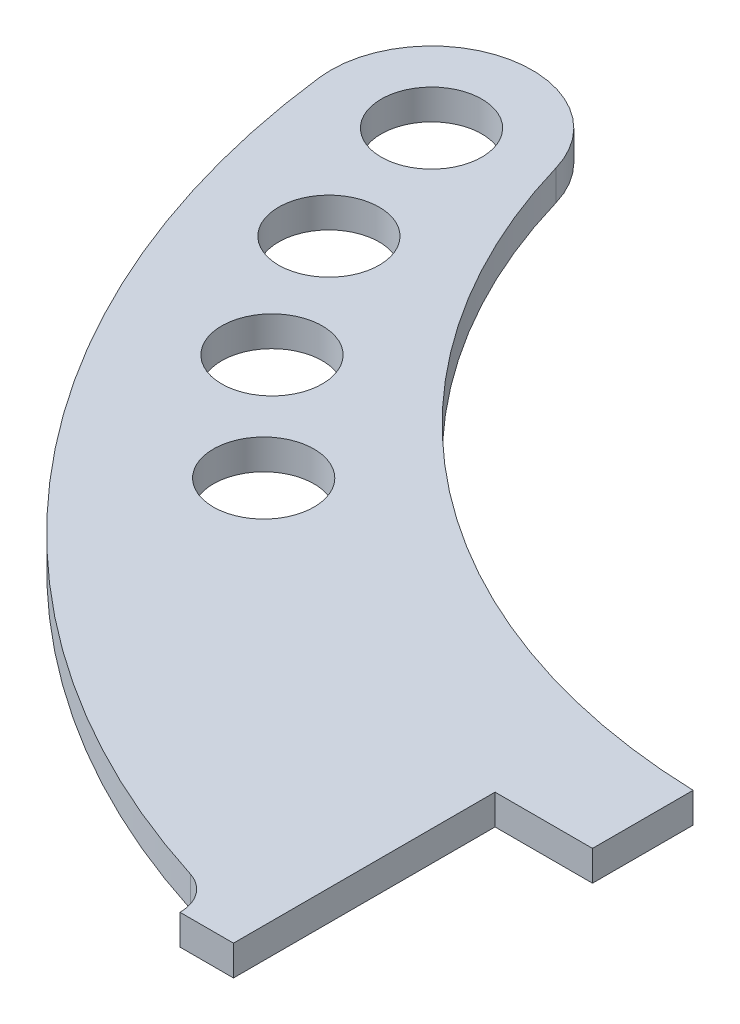
ISO-10303-21;
HEADER;
FILE_DESCRIPTION(('STEP AP214'),'2;1');
FILE_NAME('part.step','',(''),(''),'','','');
FILE_SCHEMA(('AUTOMOTIVE_DESIGN { 1 0 10303 214 1 1 1 1 }'));
ENDSEC;
DATA;
#1=APPLICATION_CONTEXT('core data for automotive mechanical design processes');
#2=APPLICATION_PROTOCOL_DEFINITION('international standard','automotive_design',2000,#1);
#3=PRODUCT_CONTEXT('',#1,'mechanical');
#4=PRODUCT('Part','Part','',(#3));
#5=PRODUCT_RELATED_PRODUCT_CATEGORY('part','',(#4));
#6=PRODUCT_DEFINITION_FORMATION('','',#4);
#7=PRODUCT_DEFINITION_CONTEXT('part definition',#1,'design');
#8=PRODUCT_DEFINITION('design','',#6,#7);
#9=PRODUCT_DEFINITION_SHAPE('','',#8);
#10=(LENGTH_UNIT() NAMED_UNIT(*) SI_UNIT(.MILLI.,.METRE.));
#11=(NAMED_UNIT(*) PLANE_ANGLE_UNIT() SI_UNIT($,.RADIAN.));
#12=(NAMED_UNIT(*) SI_UNIT($,.STERADIAN.) SOLID_ANGLE_UNIT());
#13=UNCERTAINTY_MEASURE_WITH_UNIT(LENGTH_MEASURE(1.E-05),#10,'distance_accuracy_value','');
#14=(GEOMETRIC_REPRESENTATION_CONTEXT(3) GLOBAL_UNCERTAINTY_ASSIGNED_CONTEXT((#13)) GLOBAL_UNIT_ASSIGNED_CONTEXT((#10,
#11,#12)) REPRESENTATION_CONTEXT('',''));
#15=CARTESIAN_POINT('',(0.,0.,0.));
#16=DIRECTION('',(0.,0.,1.));
#17=DIRECTION('',(1.,0.,0.));
#18=AXIS2_PLACEMENT_3D('',#15,#16,#17);
#19=CARTESIAN_POINT('',(145.,-207.873034199098,540.));
#20=DIRECTION('',(0.,-1.,0.));
#21=DIRECTION('',(0.,0.,-1.));
#22=AXIS2_PLACEMENT_3D('',#19,#20,#21);
#23=PLANE('',#22);
#24=CARTESIAN_POINT('',(96.7810636189554,-207.873034199098,588.462057724622));
#25=DIRECTION('',(0.,1.,0.));
#26=DIRECTION('',(0.,0.,1.));
#27=AXIS2_PLACEMENT_3D('',#24,#25,#26);
#28=CIRCLE('',#27,5.00000000000001);
#29=CARTESIAN_POINT('',(96.7810636189554,-207.873034199098,593.462057724622));
#30=VERTEX_POINT('',#29);
#31=EDGE_CURVE('E119',#30,#30,#28,.T.);
#32=ORIENTED_EDGE('',*,*,#31,.F.);
#33=EDGE_LOOP('',(#32));
#34=FACE_BOUND('',#33,.T.);
#35=CARTESIAN_POINT('',(86.5943439074399,-207.873034199098,577.45157446915));
#36=DIRECTION('',(0.,1.,0.));
#37=DIRECTION('',(0.,0.,1.));
#38=AXIS2_PLACEMENT_3D('',#35,#36,#37);
#39=CIRCLE('',#38,5.00000000000001);
#40=CARTESIAN_POINT('',(86.5943439074399,-207.873034199098,582.45157446915));
#41=VERTEX_POINT('',#40);
#42=EDGE_CURVE('E185',#41,#41,#39,.T.);
#43=ORIENTED_EDGE('',*,*,#42,.F.);
#44=EDGE_LOOP('',(#43));
#45=FACE_BOUND('',#44,.T.);
#46=CARTESIAN_POINT('',(79.2027781411678,-207.873034199098,564.399189418024));
#47=DIRECTION('',(0.,1.,0.));
#48=DIRECTION('',(0.,0.,1.));
#49=AXIS2_PLACEMENT_3D('',#46,#47,#48);
#50=CIRCLE('',#49,5.00000000000001);
#51=CARTESIAN_POINT('',(79.2027781411678,-207.873034199098,569.399189418024));
#52=VERTEX_POINT('',#51);
#53=EDGE_CURVE('E189',#52,#52,#50,.T.);
#54=ORIENTED_EDGE('',*,*,#53,.F.);
#55=EDGE_LOOP('',(#54));
#56=FACE_BOUND('',#55,.T.);
#57=CARTESIAN_POINT('',(75.,-207.873034199098,550.));
#58=DIRECTION('',(0.,1.,0.));
#59=DIRECTION('',(0.,0.,1.));
#60=AXIS2_PLACEMENT_3D('',#57,#58,#59);
#61=CIRCLE('',#60,5.00000000000001);
#62=CARTESIAN_POINT('',(75.,-207.873034199098,555.));
#63=VERTEX_POINT('',#62);
#64=EDGE_CURVE('E192',#63,#63,#61,.T.);
#65=ORIENTED_EDGE('',*,*,#64,.F.);
#66=EDGE_LOOP('',(#65));
#67=FACE_BOUND('',#66,.T.);
#68=CARTESIAN_POINT('',(147.009050664026,-207.873034199098,529.031055761777));
#69=DIRECTION('',(0.,1.,0.));
#70=DIRECTION('',(0.,0.,1.));
#71=AXIS2_PLACEMENT_3D('',#68,#69,#70);
#72=CIRCLE('',#71,65.);
#73=CARTESIAN_POINT('',(84.6012067552035,-207.873034199098,547.204140768237));
#74=VERTEX_POINT('',#73);
#75=CARTESIAN_POINT('',(145.,-207.873034199098,594.));
#76=VERTEX_POINT('',#75);
#77=EDGE_CURVE('E61',#74,#76,#72,.T.);
#78=ORIENTED_EDGE('',*,*,#77,.F.);
#79=CARTESIAN_POINT('',(75.,-207.873034199098,550.));
#80=DIRECTION('',(0.,1.,0.));
#81=DIRECTION('',(0.,0.,1.));
#82=AXIS2_PLACEMENT_3D('',#79,#80,#81);
#83=CIRCLE('',#82,10.);
#84=CARTESIAN_POINT('',(65.0722641480603,-207.873034199098,551.200025355612));
#85=VERTEX_POINT('',#84);
#86=EDGE_CURVE('E214',#74,#85,#83,.T.);
#87=ORIENTED_EDGE('',*,*,#86,.T.);
#88=CARTESIAN_POINT('',(154.421886815518,-207.873034199098,540.399797155107));
#89=DIRECTION('',(0.,1.,0.));
#90=DIRECTION('',(0.,0.,1.));
#91=AXIS2_PLACEMENT_3D('',#88,#89,#90);
#92=CIRCLE('',#91,90.);
#93=CARTESIAN_POINT('',(127.20944199215,-207.873034199098,626.187225410856));
#94=VERTEX_POINT('',#93);
#95=EDGE_CURVE('E211',#85,#94,#92,.T.);
#96=ORIENTED_EDGE('',*,*,#95,.T.);
#97=CARTESIAN_POINT('',(126.,-207.873034199098,630.));
#98=DIRECTION('',(0.,1.,0.));
#99=DIRECTION('',(0.,0.,1.));
#100=AXIS2_PLACEMENT_3D('',#97,#98,#99);
#101=CIRCLE('',#100,4.00000000000003);
#102=CARTESIAN_POINT('',(130.,-207.873034199098,630.));
#103=VERTEX_POINT('',#102);
#104=EDGE_CURVE('E208',#94,#103,#101,.F.);
#105=ORIENTED_EDGE('',*,*,#104,.T.);
#106=DIRECTION('',(-1.,0.,0.));
#107=VECTOR('',#106,1.);
#108=CARTESIAN_POINT('',(145.,-207.873034199098,630.));
#109=LINE('',#108,#107);
#110=CARTESIAN_POINT('',(135.315012025401,-207.873034199098,630.));
#111=VERTEX_POINT('',#110);
#112=EDGE_CURVE('E134',#111,#103,#109,.T.);
#113=ORIENTED_EDGE('',*,*,#112,.F.);
#114=DIRECTION('',(0.,0.,-1.));
#115=VECTOR('',#114,1.);
#116=CARTESIAN_POINT('',(135.315012025401,-207.873034199098,0.));
#117=LINE('',#116,#115);
#118=CARTESIAN_POINT('',(135.315012025401,-207.873034199098,604.));
#119=VERTEX_POINT('',#118);
#120=EDGE_CURVE('E118',#111,#119,#117,.T.);
#121=ORIENTED_EDGE('',*,*,#120,.T.);
#122=DIRECTION('',(1.,0.,0.));
#123=VECTOR('',#122,1.);
#124=CARTESIAN_POINT('',(0.,-207.873034199098,604.));
#125=LINE('',#124,#123);
#126=CARTESIAN_POINT('',(145.,-207.873034199098,604.));
#127=VERTEX_POINT('',#126);
#128=EDGE_CURVE('E105',#119,#127,#125,.T.);
#129=ORIENTED_EDGE('',*,*,#128,.T.);
#130=DIRECTION('',(0.,0.,1.));
#131=VECTOR('',#130,1.);
#132=CARTESIAN_POINT('',(145.,-207.873034199098,540.));
#133=LINE('',#132,#131);
#134=EDGE_CURVE('E116',#76,#127,#133,.T.);
#135=ORIENTED_EDGE('',*,*,#134,.F.);
#136=EDGE_LOOP('',(#78,#87,#96,#105,#113,#121,#129,#135));
#137=FACE_BOUND('',#136,.T.);
#138=ADVANCED_FACE('F39',(#34,#45,#56,#67,#137),#23,.F.);
#139=CARTESIAN_POINT('',(145.,-210.873034199098,540.));
#140=DIRECTION('',(0.,1.,0.));
#141=DIRECTION('',(0.,0.,1.));
#142=AXIS2_PLACEMENT_3D('',#139,#140,#141);
#143=PLANE('',#142);
#144=CARTESIAN_POINT('',(96.7810636189554,-210.873034199098,588.462057724622));
#145=DIRECTION('',(0.,1.,0.));
#146=DIRECTION('',(0.,0.,1.));
#147=AXIS2_PLACEMENT_3D('',#144,#145,#146);
#148=CIRCLE('',#147,5.00000000000001);
#149=CARTESIAN_POINT('',(96.7810636189554,-210.873034199098,593.462057724622));
#150=VERTEX_POINT('',#149);
#151=EDGE_CURVE('E123',#150,#150,#148,.T.);
#152=ORIENTED_EDGE('',*,*,#151,.T.);
#153=EDGE_LOOP('',(#152));
#154=FACE_BOUND('',#153,.T.);
#155=CARTESIAN_POINT('',(86.5943439074399,-210.873034199098,577.45157446915));
#156=DIRECTION('',(0.,1.,0.));
#157=DIRECTION('',(0.,0.,1.));
#158=AXIS2_PLACEMENT_3D('',#155,#156,#157);
#159=CIRCLE('',#158,5.00000000000001);
#160=CARTESIAN_POINT('',(86.5943439074399,-210.873034199098,582.45157446915));
#161=VERTEX_POINT('',#160);
#162=EDGE_CURVE('E128',#161,#161,#159,.T.);
#163=ORIENTED_EDGE('',*,*,#162,.T.);
#164=EDGE_LOOP('',(#163));
#165=FACE_BOUND('',#164,.T.);
#166=CARTESIAN_POINT('',(79.2027781411678,-210.873034199098,564.399189418024));
#167=DIRECTION('',(0.,1.,0.));
#168=DIRECTION('',(0.,0.,1.));
#169=AXIS2_PLACEMENT_3D('',#166,#167,#168);
#170=CIRCLE('',#169,5.00000000000001);
#171=CARTESIAN_POINT('',(79.2027781411678,-210.873034199098,569.399189418024));
#172=VERTEX_POINT('',#171);
#173=EDGE_CURVE('E145',#172,#172,#170,.T.);
#174=ORIENTED_EDGE('',*,*,#173,.T.);
#175=EDGE_LOOP('',(#174));
#176=FACE_BOUND('',#175,.T.);
#177=CARTESIAN_POINT('',(75.,-210.873034199098,550.));
#178=DIRECTION('',(0.,1.,0.));
#179=DIRECTION('',(0.,0.,1.));
#180=AXIS2_PLACEMENT_3D('',#177,#178,#179);
#181=CIRCLE('',#180,5.00000000000001);
#182=CARTESIAN_POINT('',(75.,-210.873034199098,555.));
#183=VERTEX_POINT('',#182);
#184=EDGE_CURVE('E142',#183,#183,#181,.T.);
#185=ORIENTED_EDGE('',*,*,#184,.T.);
#186=EDGE_LOOP('',(#185));
#187=FACE_BOUND('',#186,.T.);
#188=CARTESIAN_POINT('',(154.421886815518,-210.873034199098,540.399797155107));
#189=DIRECTION('',(0.,1.,0.));
#190=DIRECTION('',(0.,0.,1.));
#191=AXIS2_PLACEMENT_3D('',#188,#189,#190);
#192=CIRCLE('',#191,90.);
#193=CARTESIAN_POINT('',(65.0722641480603,-210.873034199098,551.200025355612));
#194=VERTEX_POINT('',#193);
#195=CARTESIAN_POINT('',(127.20944199215,-210.873034199098,626.187225410856));
#196=VERTEX_POINT('',#195);
#197=EDGE_CURVE('E139',#194,#196,#192,.T.);
#198=ORIENTED_EDGE('',*,*,#197,.F.);
#199=CARTESIAN_POINT('',(75.,-210.873034199098,550.));
#200=DIRECTION('',(0.,1.,0.));
#201=DIRECTION('',(0.,0.,1.));
#202=AXIS2_PLACEMENT_3D('',#199,#200,#201);
#203=CIRCLE('',#202,10.);
#204=CARTESIAN_POINT('',(84.6012067552035,-210.873034199098,547.204140768237));
#205=VERTEX_POINT('',#204);
#206=EDGE_CURVE('E111',#205,#194,#203,.T.);
#207=ORIENTED_EDGE('',*,*,#206,.F.);
#208=CARTESIAN_POINT('',(147.009050664026,-210.873034199098,529.031055761777));
#209=DIRECTION('',(0.,1.,0.));
#210=DIRECTION('',(0.,0.,1.));
#211=AXIS2_PLACEMENT_3D('',#208,#209,#210);
#212=CIRCLE('',#211,65.);
#213=CARTESIAN_POINT('',(145.,-210.873034199098,594.));
#214=VERTEX_POINT('',#213);
#215=EDGE_CURVE('E220',#205,#214,#212,.T.);
#216=ORIENTED_EDGE('',*,*,#215,.T.);
#217=DIRECTION('',(0.,0.,-1.));
#218=VECTOR('',#217,1.);
#219=CARTESIAN_POINT('',(145.,-210.873034199098,540.));
#220=LINE('',#219,#218);
#221=CARTESIAN_POINT('',(145.,-210.873034199098,604.));
#222=VERTEX_POINT('',#221);
#223=EDGE_CURVE('E122',#222,#214,#220,.T.);
#224=ORIENTED_EDGE('',*,*,#223,.F.);
#225=DIRECTION('',(1.,0.,0.));
#226=VECTOR('',#225,1.);
#227=CARTESIAN_POINT('',(145.,-210.873034199098,604.));
#228=LINE('',#227,#226);
#229=CARTESIAN_POINT('',(135.315012025401,-210.873034199098,604.));
#230=VERTEX_POINT('',#229);
#231=EDGE_CURVE('E53',#230,#222,#228,.T.);
#232=ORIENTED_EDGE('',*,*,#231,.F.);
#233=DIRECTION('',(0.,0.,-1.));
#234=VECTOR('',#233,1.);
#235=CARTESIAN_POINT('',(135.315012025401,-210.873034199098,540.));
#236=LINE('',#235,#234);
#237=CARTESIAN_POINT('',(135.315012025401,-210.873034199098,630.));
#238=VERTEX_POINT('',#237);
#239=EDGE_CURVE('E11',#238,#230,#236,.T.);
#240=ORIENTED_EDGE('',*,*,#239,.F.);
#241=DIRECTION('',(-1.,0.,0.));
#242=VECTOR('',#241,1.);
#243=CARTESIAN_POINT('',(145.,-210.873034199098,630.));
#244=LINE('',#243,#242);
#245=CARTESIAN_POINT('',(130.,-210.873034199098,630.));
#246=VERTEX_POINT('',#245);
#247=EDGE_CURVE('E125',#238,#246,#244,.T.);
#248=ORIENTED_EDGE('',*,*,#247,.T.);
#249=CARTESIAN_POINT('',(126.,-210.873034199098,630.));
#250=DIRECTION('',(0.,1.,0.));
#251=DIRECTION('',(0.,0.,1.));
#252=AXIS2_PLACEMENT_3D('',#249,#250,#251);
#253=CIRCLE('',#252,4.00000000000003);
#254=EDGE_CURVE('E46',#196,#246,#253,.F.);
#255=ORIENTED_EDGE('',*,*,#254,.F.);
#256=EDGE_LOOP('',(#198,#207,#216,#224,#232,#240,#248,#255));
#257=FACE_BOUND('',#256,.T.);
#258=ADVANCED_FACE('F151',(#154,#165,#176,#187,#257),#143,.F.);
#259=CARTESIAN_POINT('',(145.,-207.873034199098,630.));
#260=DIRECTION('',(0.,0.,-1.));
#261=DIRECTION('',(-1.,0.,0.));
#262=AXIS2_PLACEMENT_3D('',#259,#260,#261);
#263=PLANE('',#262);
#264=DIRECTION('',(0.,1.,0.));
#265=VECTOR('',#264,1.);
#266=CARTESIAN_POINT('',(135.315012025401,-217.873034199098,630.));
#267=LINE('',#266,#265);
#268=EDGE_CURVE('E203',#238,#111,#267,.T.);
#269=ORIENTED_EDGE('',*,*,#268,.T.);
#270=ORIENTED_EDGE('',*,*,#112,.T.);
#271=DIRECTION('',(0.,1.,0.));
#272=VECTOR('',#271,1.);
#273=CARTESIAN_POINT('',(130.,-217.873034199098,630.));
#274=LINE('',#273,#272);
#275=EDGE_CURVE('E218',#246,#103,#274,.T.);
#276=ORIENTED_EDGE('',*,*,#275,.F.);
#277=ORIENTED_EDGE('',*,*,#247,.F.);
#278=EDGE_LOOP('',(#269,#270,#276,#277));
#279=FACE_BOUND('',#278,.T.);
#280=ADVANCED_FACE('F177',(#279),#263,.F.);
#281=CARTESIAN_POINT('',(145.,0.,0.));
#282=DIRECTION('',(-1.,0.,0.));
#283=DIRECTION('',(0.,0.,1.));
#284=AXIS2_PLACEMENT_3D('',#281,#282,#283);
#285=PLANE('',#284);
#286=DIRECTION('',(0.,1.,0.));
#287=VECTOR('',#286,1.);
#288=CARTESIAN_POINT('',(145.,0.,604.));
#289=LINE('',#288,#287);
#290=EDGE_CURVE('E102',#222,#127,#289,.T.);
#291=ORIENTED_EDGE('',*,*,#290,.F.);
#292=ORIENTED_EDGE('',*,*,#223,.T.);
#293=DIRECTION('',(0.,1.,0.));
#294=VECTOR('',#293,1.);
#295=CARTESIAN_POINT('',(145.,-217.873034199098,594.));
#296=LINE('',#295,#294);
#297=EDGE_CURVE('E112',#214,#76,#296,.T.);
#298=ORIENTED_EDGE('',*,*,#297,.T.);
#299=ORIENTED_EDGE('',*,*,#134,.T.);
#300=EDGE_LOOP('',(#291,#292,#298,#299));
#301=FACE_BOUND('',#300,.T.);
#302=ADVANCED_FACE('F121',(#301),#285,.F.);
#303=CARTESIAN_POINT('',(126.,-217.873034199098,630.));
#304=DIRECTION('',(0.,1.,0.));
#305=DIRECTION('',(0.,0.,1.));
#306=AXIS2_PLACEMENT_3D('',#303,#304,#305);
#307=CYLINDRICAL_SURFACE('',#306,4.00000000000003);
#308=ORIENTED_EDGE('',*,*,#254,.T.);
#309=ORIENTED_EDGE('',*,*,#275,.T.);
#310=ORIENTED_EDGE('',*,*,#104,.F.);
#311=DIRECTION('',(0.,1.,0.));
#312=VECTOR('',#311,1.);
#313=CARTESIAN_POINT('',(127.20944199215,-217.873034199098,626.187225410856));
#314=LINE('',#313,#312);
#315=EDGE_CURVE('E217',#196,#94,#314,.T.);
#316=ORIENTED_EDGE('',*,*,#315,.F.);
#317=EDGE_LOOP('',(#308,#309,#310,#316));
#318=FACE_BOUND('',#317,.T.);
#319=ADVANCED_FACE('F239',(#318),#307,.F.);
#320=CARTESIAN_POINT('',(154.421886815518,-217.873034199098,540.399797155107));
#321=DIRECTION('',(0.,1.,0.));
#322=DIRECTION('',(0.,0.,1.));
#323=AXIS2_PLACEMENT_3D('',#320,#321,#322);
#324=CYLINDRICAL_SURFACE('',#323,90.);
#325=ORIENTED_EDGE('',*,*,#197,.T.);
#326=ORIENTED_EDGE('',*,*,#315,.T.);
#327=ORIENTED_EDGE('',*,*,#95,.F.);
#328=DIRECTION('',(0.,1.,0.));
#329=VECTOR('',#328,1.);
#330=CARTESIAN_POINT('',(65.0722641480603,-217.873034199098,551.200025355612));
#331=LINE('',#330,#329);
#332=EDGE_CURVE('E221',#194,#85,#331,.T.);
#333=ORIENTED_EDGE('',*,*,#332,.F.);
#334=EDGE_LOOP('',(#325,#326,#327,#333));
#335=FACE_BOUND('',#334,.T.);
#336=ADVANCED_FACE('F235',(#335),#324,.T.);
#337=CARTESIAN_POINT('',(75.,-217.873034199098,550.));
#338=DIRECTION('',(0.,1.,0.));
#339=DIRECTION('',(0.,0.,1.));
#340=AXIS2_PLACEMENT_3D('',#337,#338,#339);
#341=CYLINDRICAL_SURFACE('',#340,10.);
#342=ORIENTED_EDGE('',*,*,#206,.T.);
#343=ORIENTED_EDGE('',*,*,#332,.T.);
#344=ORIENTED_EDGE('',*,*,#86,.F.);
#345=DIRECTION('',(0.,1.,0.));
#346=VECTOR('',#345,1.);
#347=CARTESIAN_POINT('',(84.6012067552035,-217.873034199098,547.204140768237));
#348=LINE('',#347,#346);
#349=EDGE_CURVE('E194',#205,#74,#348,.T.);
#350=ORIENTED_EDGE('',*,*,#349,.F.);
#351=EDGE_LOOP('',(#342,#343,#344,#350));
#352=FACE_BOUND('',#351,.T.);
#353=ADVANCED_FACE('F230',(#352),#341,.T.);
#354=CARTESIAN_POINT('',(147.009050664026,-217.873034199098,529.031055761777));
#355=DIRECTION('',(0.,1.,0.));
#356=DIRECTION('',(0.,0.,1.));
#357=AXIS2_PLACEMENT_3D('',#354,#355,#356);
#358=CYLINDRICAL_SURFACE('',#357,65.);
#359=ORIENTED_EDGE('',*,*,#349,.T.);
#360=ORIENTED_EDGE('',*,*,#77,.T.);
#361=ORIENTED_EDGE('',*,*,#297,.F.);
#362=ORIENTED_EDGE('',*,*,#215,.F.);
#363=EDGE_LOOP('',(#359,#360,#361,#362));
#364=FACE_BOUND('',#363,.T.);
#365=ADVANCED_FACE('F228',(#364),#358,.F.);
#366=CARTESIAN_POINT('',(135.315012025401,-217.873034199098,0.));
#367=DIRECTION('',(1.,0.,0.));
#368=DIRECTION('',(0.,0.,-1.));
#369=AXIS2_PLACEMENT_3D('',#366,#367,#368);
#370=PLANE('',#369);
#371=ORIENTED_EDGE('',*,*,#239,.T.);
#372=DIRECTION('',(0.,1.,0.));
#373=VECTOR('',#372,1.);
#374=CARTESIAN_POINT('',(135.315012025401,-217.873034199098,604.));
#375=LINE('',#374,#373);
#376=EDGE_CURVE('E201',#230,#119,#375,.T.);
#377=ORIENTED_EDGE('',*,*,#376,.T.);
#378=ORIENTED_EDGE('',*,*,#120,.F.);
#379=ORIENTED_EDGE('',*,*,#268,.F.);
#380=EDGE_LOOP('',(#371,#377,#378,#379));
#381=FACE_BOUND('',#380,.T.);
#382=ADVANCED_FACE('F245',(#381),#370,.T.);
#383=CARTESIAN_POINT('',(0.,-217.873034199098,604.));
#384=DIRECTION('',(0.,0.,1.));
#385=DIRECTION('',(1.,0.,0.));
#386=AXIS2_PLACEMENT_3D('',#383,#384,#385);
#387=PLANE('',#386);
#388=ORIENTED_EDGE('',*,*,#231,.T.);
#389=ORIENTED_EDGE('',*,*,#290,.T.);
#390=ORIENTED_EDGE('',*,*,#128,.F.);
#391=ORIENTED_EDGE('',*,*,#376,.F.);
#392=EDGE_LOOP('',(#388,#389,#390,#391));
#393=FACE_BOUND('',#392,.T.);
#394=ADVANCED_FACE('F104',(#393),#387,.T.);
#395=CARTESIAN_POINT('',(75.,-217.873034199098,550.));
#396=DIRECTION('',(0.,1.,0.));
#397=DIRECTION('',(0.,0.,1.));
#398=AXIS2_PLACEMENT_3D('',#395,#396,#397);
#399=CYLINDRICAL_SURFACE('',#398,5.00000000000001);
#400=ORIENTED_EDGE('',*,*,#64,.T.);
#401=EDGE_LOOP('',(#400));
#402=FACE_BOUND('',#401,.T.);
#403=ORIENTED_EDGE('',*,*,#184,.F.);
#404=EDGE_LOOP('',(#403));
#405=FACE_BOUND('',#404,.T.);
#406=ADVANCED_FACE('F167',(#402,#405),#399,.F.);
#407=CARTESIAN_POINT('',(79.2027781411678,-217.873034199098,564.399189418024));
#408=DIRECTION('',(0.,1.,0.));
#409=DIRECTION('',(0.,0.,1.));
#410=AXIS2_PLACEMENT_3D('',#407,#408,#409);
#411=CYLINDRICAL_SURFACE('',#410,5.00000000000001);
#412=ORIENTED_EDGE('',*,*,#53,.T.);
#413=EDGE_LOOP('',(#412));
#414=FACE_BOUND('',#413,.T.);
#415=ORIENTED_EDGE('',*,*,#173,.F.);
#416=EDGE_LOOP('',(#415));
#417=FACE_BOUND('',#416,.T.);
#418=ADVANCED_FACE('F157',(#414,#417),#411,.F.);
#419=CARTESIAN_POINT('',(86.5943439074399,-217.873034199098,577.45157446915));
#420=DIRECTION('',(0.,1.,0.));
#421=DIRECTION('',(0.,0.,1.));
#422=AXIS2_PLACEMENT_3D('',#419,#420,#421);
#423=CYLINDRICAL_SURFACE('',#422,5.00000000000001);
#424=ORIENTED_EDGE('',*,*,#42,.T.);
#425=EDGE_LOOP('',(#424));
#426=FACE_BOUND('',#425,.T.);
#427=ORIENTED_EDGE('',*,*,#162,.F.);
#428=EDGE_LOOP('',(#427));
#429=FACE_BOUND('',#428,.T.);
#430=ADVANCED_FACE('F154',(#426,#429),#423,.F.);
#431=CARTESIAN_POINT('',(96.7810636189554,-217.873034199098,588.462057724622));
#432=DIRECTION('',(0.,1.,0.));
#433=DIRECTION('',(0.,0.,1.));
#434=AXIS2_PLACEMENT_3D('',#431,#432,#433);
#435=CYLINDRICAL_SURFACE('',#434,5.00000000000001);
#436=ORIENTED_EDGE('',*,*,#31,.T.);
#437=EDGE_LOOP('',(#436));
#438=FACE_BOUND('',#437,.T.);
#439=ORIENTED_EDGE('',*,*,#151,.F.);
#440=EDGE_LOOP('',(#439));
#441=FACE_BOUND('',#440,.T.);
#442=ADVANCED_FACE('F156',(#438,#441),#435,.F.);
#443=CLOSED_SHELL('',(#138,#258,#280,#302,#319,#336,#353,#365,#382,#394,#406,#418,#430,#442));
#444=MANIFOLD_SOLID_BREP('B2',#443);
#445=ADVANCED_BREP_SHAPE_REPRESENTATION('',(#18,#444),#14);
#446=SHAPE_DEFINITION_REPRESENTATION(#9,#445);
ENDSEC;
END-ISO-10303-21;
